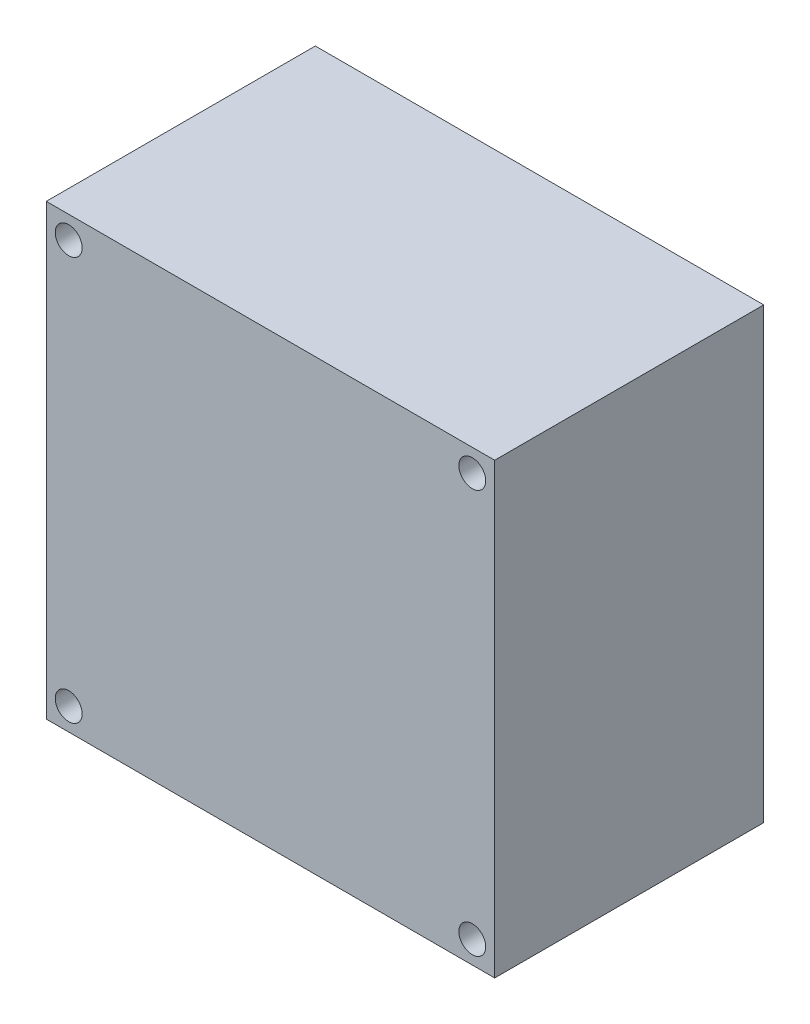
ISO-10303-21;
HEADER;
FILE_DESCRIPTION(('STEP AP214'),'2;1');
FILE_NAME('part.step','',(''),(''),'','','');
FILE_SCHEMA(('AUTOMOTIVE_DESIGN { 1 0 10303 214 1 1 1 1 }'));
ENDSEC;
DATA;
#1=APPLICATION_CONTEXT('core data for automotive mechanical design processes');
#2=APPLICATION_PROTOCOL_DEFINITION('international standard','automotive_design',2000,#1);
#3=PRODUCT_CONTEXT('',#1,'mechanical');
#4=PRODUCT('Part','Part','',(#3));
#5=PRODUCT_RELATED_PRODUCT_CATEGORY('part','',(#4));
#6=PRODUCT_DEFINITION_FORMATION('','',#4);
#7=PRODUCT_DEFINITION_CONTEXT('part definition',#1,'design');
#8=PRODUCT_DEFINITION('design','',#6,#7);
#9=PRODUCT_DEFINITION_SHAPE('','',#8);
#10=(LENGTH_UNIT() NAMED_UNIT(*) SI_UNIT(.MILLI.,.METRE.));
#11=(NAMED_UNIT(*) PLANE_ANGLE_UNIT() SI_UNIT($,.RADIAN.));
#12=(NAMED_UNIT(*) SI_UNIT($,.STERADIAN.) SOLID_ANGLE_UNIT());
#13=UNCERTAINTY_MEASURE_WITH_UNIT(LENGTH_MEASURE(1.E-05),#10,'distance_accuracy_value','');
#14=(GEOMETRIC_REPRESENTATION_CONTEXT(3) GLOBAL_UNCERTAINTY_ASSIGNED_CONTEXT((#13)) GLOBAL_UNIT_ASSIGNED_CONTEXT((#10,
#11,#12)) REPRESENTATION_CONTEXT('',''));
#15=CARTESIAN_POINT('',(0.,0.,0.));
#16=DIRECTION('',(0.,0.,1.));
#17=DIRECTION('',(1.,0.,0.));
#18=AXIS2_PLACEMENT_3D('',#15,#16,#17);
#19=CARTESIAN_POINT('',(15.0118063536438,214.599490363246,30.));
#20=DIRECTION('',(0.,0.,1.));
#21=DIRECTION('',(1.,0.,0.));
#22=AXIS2_PLACEMENT_3D('',#19,#20,#21);
#23=PLANE('',#22);
#24=CARTESIAN_POINT('',(12.5118063536437,212.099490363246,30.));
#25=DIRECTION('',(0.,0.,1.));
#26=DIRECTION('',(1.,0.,0.));
#27=AXIS2_PLACEMENT_3D('',#24,#25,#26);
#28=CIRCLE('',#27,1.5);
#29=CARTESIAN_POINT('',(14.0118063536437,212.099490363246,30.));
#30=VERTEX_POINT('',#29);
#31=EDGE_CURVE('E119',#30,#30,#28,.T.);
#32=ORIENTED_EDGE('',*,*,#31,.F.);
#33=EDGE_LOOP('',(#32));
#34=FACE_BOUND('',#33,.T.);
#35=CARTESIAN_POINT('',(12.5118063536439,167.099490363246,30.));
#36=DIRECTION('',(0.,0.,1.));
#37=DIRECTION('',(1.,0.,0.));
#38=AXIS2_PLACEMENT_3D('',#35,#36,#37);
#39=CIRCLE('',#38,1.5);
#40=CARTESIAN_POINT('',(14.0118063536439,167.099490363246,30.));
#41=VERTEX_POINT('',#40);
#42=EDGE_CURVE('E98',#41,#41,#39,.T.);
#43=ORIENTED_EDGE('',*,*,#42,.F.);
#44=EDGE_LOOP('',(#43));
#45=FACE_BOUND('',#44,.T.);
#46=DIRECTION('',(0.,1.,0.));
#47=VECTOR('',#46,1.);
#48=CARTESIAN_POINT('',(15.0118063536439,164.599490363246,30.));
#49=LINE('',#48,#47);
#50=CARTESIAN_POINT('',(15.0118063536439,164.599490363246,30.));
#51=VERTEX_POINT('',#50);
#52=CARTESIAN_POINT('',(15.0118063536438,214.599490363246,30.));
#53=VERTEX_POINT('',#52);
#54=EDGE_CURVE('E83',#51,#53,#49,.T.);
#55=ORIENTED_EDGE('',*,*,#54,.T.);
#56=DIRECTION('',(-1.,0.,0.));
#57=VECTOR('',#56,1.);
#58=CARTESIAN_POINT('',(15.0118063536438,214.599490363246,30.));
#59=LINE('',#58,#57);
#60=CARTESIAN_POINT('',(-34.9881936463562,214.599490363246,30.));
#61=VERTEX_POINT('',#60);
#62=EDGE_CURVE('E78',#53,#61,#59,.T.);
#63=ORIENTED_EDGE('',*,*,#62,.T.);
#64=DIRECTION('',(0.,-1.,0.));
#65=VECTOR('',#64,1.);
#66=CARTESIAN_POINT('',(-34.9881936463562,164.599490363246,30.));
#67=LINE('',#66,#65);
#68=CARTESIAN_POINT('',(-34.9881936463562,164.599490363246,30.));
#69=VERTEX_POINT('',#68);
#70=EDGE_CURVE('E81',#61,#69,#67,.T.);
#71=ORIENTED_EDGE('',*,*,#70,.T.);
#72=DIRECTION('',(1.,0.,0.));
#73=VECTOR('',#72,1.);
#74=CARTESIAN_POINT('',(15.0118063536439,164.599490363246,30.));
#75=LINE('',#74,#73);
#76=EDGE_CURVE('E48',#69,#51,#75,.T.);
#77=ORIENTED_EDGE('',*,*,#76,.T.);
#78=EDGE_LOOP('',(#55,#63,#71,#77));
#79=FACE_BOUND('',#78,.T.);
#80=CARTESIAN_POINT('',(-32.4881936463561,167.099490363246,30.));
#81=DIRECTION('',(0.,0.,1.));
#82=DIRECTION('',(1.,0.,0.));
#83=AXIS2_PLACEMENT_3D('',#80,#81,#82);
#84=CIRCLE('',#83,1.5);
#85=CARTESIAN_POINT('',(-30.9881936463561,167.099490363246,30.));
#86=VERTEX_POINT('',#85);
#87=EDGE_CURVE('E113',#86,#86,#84,.T.);
#88=ORIENTED_EDGE('',*,*,#87,.F.);
#89=EDGE_LOOP('',(#88));
#90=FACE_BOUND('',#89,.T.);
#91=CARTESIAN_POINT('',(-32.4881936463563,212.099490363246,30.));
#92=DIRECTION('',(0.,0.,1.));
#93=DIRECTION('',(1.,0.,0.));
#94=AXIS2_PLACEMENT_3D('',#91,#92,#93);
#95=CIRCLE('',#94,1.5);
#96=CARTESIAN_POINT('',(-30.9881936463563,212.099490363246,30.));
#97=VERTEX_POINT('',#96);
#98=EDGE_CURVE('E125',#97,#97,#95,.T.);
#99=ORIENTED_EDGE('',*,*,#98,.F.);
#100=EDGE_LOOP('',(#99));
#101=FACE_BOUND('',#100,.T.);
#102=ADVANCED_FACE('F31',(#34,#45,#79,#90,#101),#23,.T.);
#103=CARTESIAN_POINT('',(15.0118063536438,214.599490363246,0.));
#104=DIRECTION('',(0.,0.,1.));
#105=DIRECTION('',(1.,0.,0.));
#106=AXIS2_PLACEMENT_3D('',#103,#104,#105);
#107=PLANE('',#106);
#108=CARTESIAN_POINT('',(12.5118063536437,212.099490363246,0.));
#109=DIRECTION('',(0.,0.,1.));
#110=DIRECTION('',(1.,0.,0.));
#111=AXIS2_PLACEMENT_3D('',#108,#109,#110);
#112=CIRCLE('',#111,1.5);
#113=CARTESIAN_POINT('',(14.0118063536437,212.099490363246,0.));
#114=VERTEX_POINT('',#113);
#115=EDGE_CURVE('E122',#114,#114,#112,.T.);
#116=ORIENTED_EDGE('',*,*,#115,.T.);
#117=EDGE_LOOP('',(#116));
#118=FACE_BOUND('',#117,.T.);
#119=CARTESIAN_POINT('',(12.5118063536439,167.099490363246,0.));
#120=DIRECTION('',(0.,0.,1.));
#121=DIRECTION('',(1.,0.,0.));
#122=AXIS2_PLACEMENT_3D('',#119,#120,#121);
#123=CIRCLE('',#122,1.5);
#124=CARTESIAN_POINT('',(14.0118063536439,167.099490363246,0.));
#125=VERTEX_POINT('',#124);
#126=EDGE_CURVE('E110',#125,#125,#123,.T.);
#127=ORIENTED_EDGE('',*,*,#126,.T.);
#128=EDGE_LOOP('',(#127));
#129=FACE_BOUND('',#128,.T.);
#130=DIRECTION('',(0.,1.,0.));
#131=VECTOR('',#130,1.);
#132=CARTESIAN_POINT('',(15.0118063536439,164.599490363246,0.));
#133=LINE('',#132,#131);
#134=CARTESIAN_POINT('',(15.0118063536439,164.599490363246,0.));
#135=VERTEX_POINT('',#134);
#136=CARTESIAN_POINT('',(15.0118063536438,214.599490363246,0.));
#137=VERTEX_POINT('',#136);
#138=EDGE_CURVE('E95',#135,#137,#133,.T.);
#139=ORIENTED_EDGE('',*,*,#138,.F.);
#140=DIRECTION('',(1.,0.,0.));
#141=VECTOR('',#140,1.);
#142=CARTESIAN_POINT('',(15.0118063536439,164.599490363246,0.));
#143=LINE('',#142,#141);
#144=CARTESIAN_POINT('',(-34.9881936463562,164.599490363246,0.));
#145=VERTEX_POINT('',#144);
#146=EDGE_CURVE('E71',#145,#135,#143,.T.);
#147=ORIENTED_EDGE('',*,*,#146,.F.);
#148=DIRECTION('',(0.,-1.,0.));
#149=VECTOR('',#148,1.);
#150=CARTESIAN_POINT('',(-34.9881936463562,164.599490363246,0.));
#151=LINE('',#150,#149);
#152=CARTESIAN_POINT('',(-34.9881936463562,214.599490363246,0.));
#153=VERTEX_POINT('',#152);
#154=EDGE_CURVE('E65',#153,#145,#151,.T.);
#155=ORIENTED_EDGE('',*,*,#154,.F.);
#156=DIRECTION('',(-1.,0.,0.));
#157=VECTOR('',#156,1.);
#158=CARTESIAN_POINT('',(15.0118063536438,214.599490363246,0.));
#159=LINE('',#158,#157);
#160=EDGE_CURVE('E87',#137,#153,#159,.T.);
#161=ORIENTED_EDGE('',*,*,#160,.F.);
#162=EDGE_LOOP('',(#139,#147,#155,#161));
#163=FACE_BOUND('',#162,.T.);
#164=CARTESIAN_POINT('',(-32.4881936463561,167.099490363246,0.));
#165=DIRECTION('',(0.,0.,1.));
#166=DIRECTION('',(1.,0.,0.));
#167=AXIS2_PLACEMENT_3D('',#164,#165,#166);
#168=CIRCLE('',#167,1.5);
#169=CARTESIAN_POINT('',(-30.9881936463561,167.099490363246,0.));
#170=VERTEX_POINT('',#169);
#171=EDGE_CURVE('E116',#170,#170,#168,.T.);
#172=ORIENTED_EDGE('',*,*,#171,.T.);
#173=EDGE_LOOP('',(#172));
#174=FACE_BOUND('',#173,.T.);
#175=CARTESIAN_POINT('',(-32.4881936463563,212.099490363246,0.));
#176=DIRECTION('',(0.,0.,1.));
#177=DIRECTION('',(1.,0.,0.));
#178=AXIS2_PLACEMENT_3D('',#175,#176,#177);
#179=CIRCLE('',#178,1.5);
#180=CARTESIAN_POINT('',(-30.9881936463563,212.099490363246,0.));
#181=VERTEX_POINT('',#180);
#182=EDGE_CURVE('E128',#181,#181,#179,.T.);
#183=ORIENTED_EDGE('',*,*,#182,.T.);
#184=EDGE_LOOP('',(#183));
#185=FACE_BOUND('',#184,.T.);
#186=ADVANCED_FACE('F106',(#118,#129,#163,#174,#185),#107,.F.);
#187=CARTESIAN_POINT('',(15.0118063536439,164.599490363246,30.));
#188=DIRECTION('',(-1.,0.,0.));
#189=DIRECTION('',(0.,-1.,0.));
#190=AXIS2_PLACEMENT_3D('',#187,#188,#189);
#191=PLANE('',#190);
#192=ORIENTED_EDGE('',*,*,#138,.T.);
#193=DIRECTION('',(0.,0.,-1.));
#194=VECTOR('',#193,1.);
#195=CARTESIAN_POINT('',(15.0118063536438,214.599490363246,30.));
#196=LINE('',#195,#194);
#197=EDGE_CURVE('E11',#53,#137,#196,.T.);
#198=ORIENTED_EDGE('',*,*,#197,.F.);
#199=ORIENTED_EDGE('',*,*,#54,.F.);
#200=DIRECTION('',(0.,0.,-1.));
#201=VECTOR('',#200,1.);
#202=CARTESIAN_POINT('',(15.0118063536439,164.599490363246,30.));
#203=LINE('',#202,#201);
#204=EDGE_CURVE('E91',#51,#135,#203,.T.);
#205=ORIENTED_EDGE('',*,*,#204,.T.);
#206=EDGE_LOOP('',(#192,#198,#199,#205));
#207=FACE_BOUND('',#206,.T.);
#208=ADVANCED_FACE('F33',(#207),#191,.F.);
#209=CARTESIAN_POINT('',(15.0118063536438,214.599490363246,30.));
#210=DIRECTION('',(0.,-1.,0.));
#211=DIRECTION('',(1.,0.,0.));
#212=AXIS2_PLACEMENT_3D('',#209,#210,#211);
#213=PLANE('',#212);
#214=ORIENTED_EDGE('',*,*,#160,.T.);
#215=DIRECTION('',(0.,0.,-1.));
#216=VECTOR('',#215,1.);
#217=CARTESIAN_POINT('',(-34.9881936463562,214.599490363246,30.));
#218=LINE('',#217,#216);
#219=EDGE_CURVE('E40',#61,#153,#218,.T.);
#220=ORIENTED_EDGE('',*,*,#219,.F.);
#221=ORIENTED_EDGE('',*,*,#62,.F.);
#222=ORIENTED_EDGE('',*,*,#197,.T.);
#223=EDGE_LOOP('',(#214,#220,#221,#222));
#224=FACE_BOUND('',#223,.T.);
#225=ADVANCED_FACE('F86',(#224),#213,.F.);
#226=CARTESIAN_POINT('',(-34.9881936463562,164.599490363246,30.));
#227=DIRECTION('',(1.,0.,0.));
#228=DIRECTION('',(0.,1.,0.));
#229=AXIS2_PLACEMENT_3D('',#226,#227,#228);
#230=PLANE('',#229);
#231=ORIENTED_EDGE('',*,*,#154,.T.);
#232=DIRECTION('',(0.,0.,-1.));
#233=VECTOR('',#232,1.);
#234=CARTESIAN_POINT('',(-34.9881936463562,164.599490363246,30.));
#235=LINE('',#234,#233);
#236=EDGE_CURVE('E88',#69,#145,#235,.T.);
#237=ORIENTED_EDGE('',*,*,#236,.F.);
#238=ORIENTED_EDGE('',*,*,#70,.F.);
#239=ORIENTED_EDGE('',*,*,#219,.T.);
#240=EDGE_LOOP('',(#231,#237,#238,#239));
#241=FACE_BOUND('',#240,.T.);
#242=ADVANCED_FACE('F89',(#241),#230,.F.);
#243=CARTESIAN_POINT('',(15.0118063536439,164.599490363246,30.));
#244=DIRECTION('',(0.,1.,0.));
#245=DIRECTION('',(0.,0.,1.));
#246=AXIS2_PLACEMENT_3D('',#243,#244,#245);
#247=PLANE('',#246);
#248=ORIENTED_EDGE('',*,*,#146,.T.);
#249=ORIENTED_EDGE('',*,*,#204,.F.);
#250=ORIENTED_EDGE('',*,*,#76,.F.);
#251=ORIENTED_EDGE('',*,*,#236,.T.);
#252=EDGE_LOOP('',(#248,#249,#250,#251));
#253=FACE_BOUND('',#252,.T.);
#254=ADVANCED_FACE('F103',(#253),#247,.F.);
#255=CARTESIAN_POINT('',(12.5118063536439,167.099490363246,30.));
#256=DIRECTION('',(0.,0.,-1.));
#257=DIRECTION('',(-1.,0.,0.));
#258=AXIS2_PLACEMENT_3D('',#255,#256,#257);
#259=CYLINDRICAL_SURFACE('',#258,1.5);
#260=ORIENTED_EDGE('',*,*,#42,.T.);
#261=EDGE_LOOP('',(#260));
#262=FACE_BOUND('',#261,.T.);
#263=ORIENTED_EDGE('',*,*,#126,.F.);
#264=EDGE_LOOP('',(#263));
#265=FACE_BOUND('',#264,.T.);
#266=ADVANCED_FACE('F148',(#262,#265),#259,.F.);
#267=CARTESIAN_POINT('',(-32.4881936463561,167.099490363246,30.));
#268=DIRECTION('',(0.,0.,-1.));
#269=DIRECTION('',(-1.,0.,0.));
#270=AXIS2_PLACEMENT_3D('',#267,#268,#269);
#271=CYLINDRICAL_SURFACE('',#270,1.5);
#272=ORIENTED_EDGE('',*,*,#87,.T.);
#273=EDGE_LOOP('',(#272));
#274=FACE_BOUND('',#273,.T.);
#275=ORIENTED_EDGE('',*,*,#171,.F.);
#276=EDGE_LOOP('',(#275));
#277=FACE_BOUND('',#276,.T.);
#278=ADVANCED_FACE('F194',(#274,#277),#271,.F.);
#279=CARTESIAN_POINT('',(12.5118063536437,212.099490363246,30.));
#280=DIRECTION('',(0.,0.,-1.));
#281=DIRECTION('',(-1.,0.,0.));
#282=AXIS2_PLACEMENT_3D('',#279,#280,#281);
#283=CYLINDRICAL_SURFACE('',#282,1.5);
#284=ORIENTED_EDGE('',*,*,#31,.T.);
#285=EDGE_LOOP('',(#284));
#286=FACE_BOUND('',#285,.T.);
#287=ORIENTED_EDGE('',*,*,#115,.F.);
#288=EDGE_LOOP('',(#287));
#289=FACE_BOUND('',#288,.T.);
#290=ADVANCED_FACE('F202',(#286,#289),#283,.F.);
#291=CARTESIAN_POINT('',(-32.4881936463563,212.099490363246,30.));
#292=DIRECTION('',(0.,0.,-1.));
#293=DIRECTION('',(-1.,0.,0.));
#294=AXIS2_PLACEMENT_3D('',#291,#292,#293);
#295=CYLINDRICAL_SURFACE('',#294,1.5);
#296=ORIENTED_EDGE('',*,*,#98,.T.);
#297=EDGE_LOOP('',(#296));
#298=FACE_BOUND('',#297,.T.);
#299=ORIENTED_EDGE('',*,*,#182,.F.);
#300=EDGE_LOOP('',(#299));
#301=FACE_BOUND('',#300,.T.);
#302=ADVANCED_FACE('F134',(#298,#301),#295,.F.);
#303=CLOSED_SHELL('',(#102,#186,#208,#225,#242,#254,#266,#278,#290,#302));
#304=MANIFOLD_SOLID_BREP('B2',#303);
#305=ADVANCED_BREP_SHAPE_REPRESENTATION('',(#18,#304),#14);
#306=SHAPE_DEFINITION_REPRESENTATION(#9,#305);
ENDSEC;
END-ISO-10303-21;
